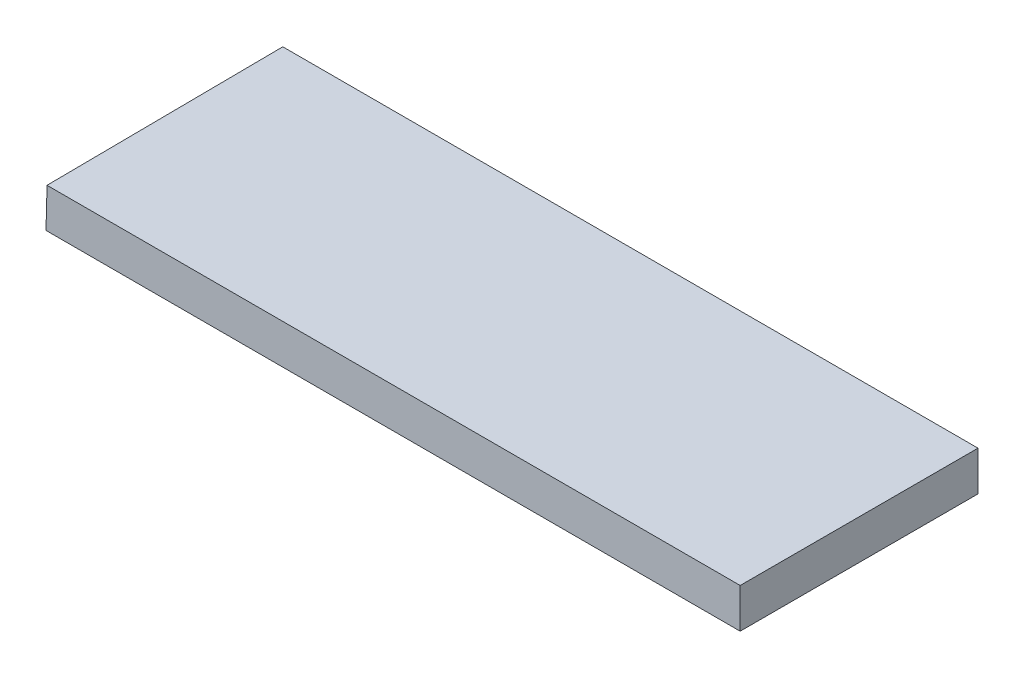
ISO-10303-21;
HEADER;
FILE_DESCRIPTION(('STEP AP214'),'2;1');
FILE_NAME('part.step','',(''),(''),'','','');
FILE_SCHEMA(('AUTOMOTIVE_DESIGN { 1 0 10303 214 1 1 1 1 }'));
ENDSEC;
DATA;
#1=APPLICATION_CONTEXT('core data for automotive mechanical design processes');
#2=APPLICATION_PROTOCOL_DEFINITION('international standard','automotive_design',2000,#1);
#3=PRODUCT_CONTEXT('',#1,'mechanical');
#4=PRODUCT('Part','Part','',(#3));
#5=PRODUCT_RELATED_PRODUCT_CATEGORY('part','',(#4));
#6=PRODUCT_DEFINITION_FORMATION('','',#4);
#7=PRODUCT_DEFINITION_CONTEXT('part definition',#1,'design');
#8=PRODUCT_DEFINITION('design','',#6,#7);
#9=PRODUCT_DEFINITION_SHAPE('','',#8);
#10=(LENGTH_UNIT() NAMED_UNIT(*) SI_UNIT(.MILLI.,.METRE.));
#11=(NAMED_UNIT(*) PLANE_ANGLE_UNIT() SI_UNIT($,.RADIAN.));
#12=(NAMED_UNIT(*) SI_UNIT($,.STERADIAN.) SOLID_ANGLE_UNIT());
#13=UNCERTAINTY_MEASURE_WITH_UNIT(LENGTH_MEASURE(1.E-05),#10,'distance_accuracy_value','');
#14=(GEOMETRIC_REPRESENTATION_CONTEXT(3) GLOBAL_UNCERTAINTY_ASSIGNED_CONTEXT((#13)) GLOBAL_UNIT_ASSIGNED_CONTEXT((#10,
#11,#12)) REPRESENTATION_CONTEXT('',''));
#15=CARTESIAN_POINT('',(0.,0.,0.));
#16=DIRECTION('',(0.,0.,1.));
#17=DIRECTION('',(1.,0.,0.));
#18=AXIS2_PLACEMENT_3D('',#15,#16,#17);
#19=CARTESIAN_POINT('',(109.518729734506,-2.8679580702388,-0.955755475004912));
#20=DIRECTION('',(-0.999619261087744,0.0261769483078608,0.00872354513260905));
#21=DIRECTION('',(-0.0261779444007335,-0.999657298891451,0.));
#22=AXIS2_PLACEMENT_3D('',#19,#20,#21);
#23=PLANE('',#22);
#24=DIRECTION('',(0.0261779444007335,0.999657298891451,0.));
#25=VECTOR('',#24,1.);
#26=CARTESIAN_POINT('',(107.799342102759,-68.84473082771,0.));
#27=LINE('',#26,#25);
#28=CARTESIAN_POINT('',(103.94841772648,-215.9,0.));
#29=VERTEX_POINT('',#28);
#30=CARTESIAN_POINT('',(104.280991593802,-203.2,0.));
#31=VERTEX_POINT('',#30);
#32=EDGE_CURVE('E37',#29,#31,#27,.T.);
#33=ORIENTED_EDGE('',*,*,#32,.F.);
#34=DIRECTION('',(0.00872653549837426,0.,0.999961923064171));
#35=VECTOR('',#34,1.);
#36=CARTESIAN_POINT('',(104.599393889507,-215.9,74.5944797876412));
#37=LINE('',#36,#35);
#38=CARTESIAN_POINT('',(104.613405052136,-215.9,76.2));
#39=VERTEX_POINT('',#38);
#40=EDGE_CURVE('E42',#29,#39,#37,.T.);
#41=ORIENTED_EDGE('',*,*,#40,.T.);
#42=DIRECTION('',(-0.0261779444007335,-0.999657298891451,0.));
#43=VECTOR('',#42,1.);
#44=CARTESIAN_POINT('',(104.958916425134,-202.705955403487,76.2));
#45=LINE('',#44,#43);
#46=CARTESIAN_POINT('',(104.945978919458,-203.2,76.2));
#47=VERTEX_POINT('',#46);
#48=EDGE_CURVE('E84',#47,#39,#45,.T.);
#49=ORIENTED_EDGE('',*,*,#48,.F.);
#50=DIRECTION('',(-0.00872653549837426,0.,-0.999961923064171));
#51=VECTOR('',#50,1.);
#52=CARTESIAN_POINT('',(104.931942430524,-203.2,74.5915776804898));
#53=LINE('',#52,#51);
#54=EDGE_CURVE('E11',#47,#31,#53,.T.);
#55=ORIENTED_EDGE('',*,*,#54,.T.);
#56=EDGE_LOOP('',(#33,#41,#49,#55));
#57=FACE_BOUND('',#56,.T.);
#58=ADVANCED_FACE('F34',(#57),#23,.T.);
#59=CARTESIAN_POINT('',(55.5788671264153,-67.4772374957186,0.));
#60=DIRECTION('',(0.,0.,-1.));
#61=DIRECTION('',(0.,1.,0.));
#62=AXIS2_PLACEMENT_3D('',#59,#60,#61);
#63=PLANE('',#62);
#64=DIRECTION('',(1.,0.,0.));
#65=VECTOR('',#64,1.);
#66=CARTESIAN_POINT('',(-79.375,-215.9,0.));
#67=LINE('',#66,#65);
#68=CARTESIAN_POINT('',(327.025,-215.9,0.));
#69=VERTEX_POINT('',#68);
#70=EDGE_CURVE('E57',#29,#69,#67,.T.);
#71=ORIENTED_EDGE('',*,*,#70,.F.);
#72=ORIENTED_EDGE('',*,*,#32,.T.);
#73=DIRECTION('',(-1.,0.,0.));
#74=VECTOR('',#73,1.);
#75=CARTESIAN_POINT('',(-79.375,-203.2,0.));
#76=LINE('',#75,#74);
#77=CARTESIAN_POINT('',(327.025,-203.2,0.));
#78=VERTEX_POINT('',#77);
#79=EDGE_CURVE('E50',#78,#31,#76,.T.);
#80=ORIENTED_EDGE('',*,*,#79,.F.);
#81=DIRECTION('',(0.,1.,0.));
#82=VECTOR('',#81,1.);
#83=CARTESIAN_POINT('',(327.025,-203.2,0.));
#84=LINE('',#83,#82);
#85=EDGE_CURVE('E102',#69,#78,#84,.T.);
#86=ORIENTED_EDGE('',*,*,#85,.F.);
#87=EDGE_LOOP('',(#71,#72,#80,#86));
#88=FACE_BOUND('',#87,.T.);
#89=ADVANCED_FACE('F109',(#88),#63,.T.);
#90=CARTESIAN_POINT('',(327.025,-203.2,76.2));
#91=DIRECTION('',(-1.,0.,0.));
#92=DIRECTION('',(0.,0.,1.));
#93=AXIS2_PLACEMENT_3D('',#90,#91,#92);
#94=PLANE('',#93);
#95=ORIENTED_EDGE('',*,*,#85,.T.);
#96=DIRECTION('',(0.,0.,-1.));
#97=VECTOR('',#96,1.);
#98=CARTESIAN_POINT('',(327.025,-203.2,76.2));
#99=LINE('',#98,#97);
#100=CARTESIAN_POINT('',(327.025,-203.2,76.2));
#101=VERTEX_POINT('',#100);
#102=EDGE_CURVE('E93',#101,#78,#99,.T.);
#103=ORIENTED_EDGE('',*,*,#102,.F.);
#104=DIRECTION('',(0.,1.,0.));
#105=VECTOR('',#104,1.);
#106=CARTESIAN_POINT('',(327.025,-203.2,76.2));
#107=LINE('',#106,#105);
#108=CARTESIAN_POINT('',(327.025,-215.9,76.2));
#109=VERTEX_POINT('',#108);
#110=EDGE_CURVE('E82',#109,#101,#107,.T.);
#111=ORIENTED_EDGE('',*,*,#110,.F.);
#112=DIRECTION('',(0.,0.,-1.));
#113=VECTOR('',#112,1.);
#114=CARTESIAN_POINT('',(327.025,-215.9,76.2));
#115=LINE('',#114,#113);
#116=EDGE_CURVE('E90',#109,#69,#115,.T.);
#117=ORIENTED_EDGE('',*,*,#116,.T.);
#118=EDGE_LOOP('',(#95,#103,#111,#117));
#119=FACE_BOUND('',#118,.T.);
#120=ADVANCED_FACE('F95',(#119),#94,.F.);
#121=CARTESIAN_POINT('',(-79.375,-215.9,76.2));
#122=DIRECTION('',(0.,1.,0.));
#123=DIRECTION('',(-1.,0.,0.));
#124=AXIS2_PLACEMENT_3D('',#121,#122,#123);
#125=PLANE('',#124);
#126=ORIENTED_EDGE('',*,*,#40,.F.);
#127=ORIENTED_EDGE('',*,*,#70,.T.);
#128=ORIENTED_EDGE('',*,*,#116,.F.);
#129=DIRECTION('',(1.,0.,0.));
#130=VECTOR('',#129,1.);
#131=CARTESIAN_POINT('',(-79.375,-215.9,76.2));
#132=LINE('',#131,#130);
#133=EDGE_CURVE('E77',#39,#109,#132,.T.);
#134=ORIENTED_EDGE('',*,*,#133,.F.);
#135=EDGE_LOOP('',(#126,#127,#128,#134));
#136=FACE_BOUND('',#135,.T.);
#137=ADVANCED_FACE('F91',(#136),#125,.F.);
#138=CARTESIAN_POINT('',(-79.375,-203.2,76.2));
#139=DIRECTION('',(0.,-1.,0.));
#140=DIRECTION('',(0.,0.,-1.));
#141=AXIS2_PLACEMENT_3D('',#138,#139,#140);
#142=PLANE('',#141);
#143=ORIENTED_EDGE('',*,*,#54,.F.);
#144=DIRECTION('',(-1.,0.,0.));
#145=VECTOR('',#144,1.);
#146=CARTESIAN_POINT('',(-79.375,-203.2,76.2));
#147=LINE('',#146,#145);
#148=EDGE_CURVE('E97',#101,#47,#147,.T.);
#149=ORIENTED_EDGE('',*,*,#148,.F.);
#150=ORIENTED_EDGE('',*,*,#102,.T.);
#151=ORIENTED_EDGE('',*,*,#79,.T.);
#152=EDGE_LOOP('',(#143,#149,#150,#151));
#153=FACE_BOUND('',#152,.T.);
#154=ADVANCED_FACE('F110',(#153),#142,.F.);
#155=CARTESIAN_POINT('',(123.825,-203.2,76.2));
#156=DIRECTION('',(0.,0.,1.));
#157=DIRECTION('',(1.,0.,0.));
#158=AXIS2_PLACEMENT_3D('',#155,#156,#157);
#159=PLANE('',#158);
#160=ORIENTED_EDGE('',*,*,#148,.T.);
#161=ORIENTED_EDGE('',*,*,#48,.T.);
#162=ORIENTED_EDGE('',*,*,#133,.T.);
#163=ORIENTED_EDGE('',*,*,#110,.T.);
#164=EDGE_LOOP('',(#160,#161,#162,#163));
#165=FACE_BOUND('',#164,.T.);
#166=ADVANCED_FACE('F80',(#165),#159,.T.);
#167=CLOSED_SHELL('',(#58,#89,#120,#137,#154,#166));
#168=MANIFOLD_SOLID_BREP('B2',#167);
#169=ADVANCED_BREP_SHAPE_REPRESENTATION('',(#18,#168),#14);
#170=SHAPE_DEFINITION_REPRESENTATION(#9,#169);
ENDSEC;
END-ISO-10303-21;
